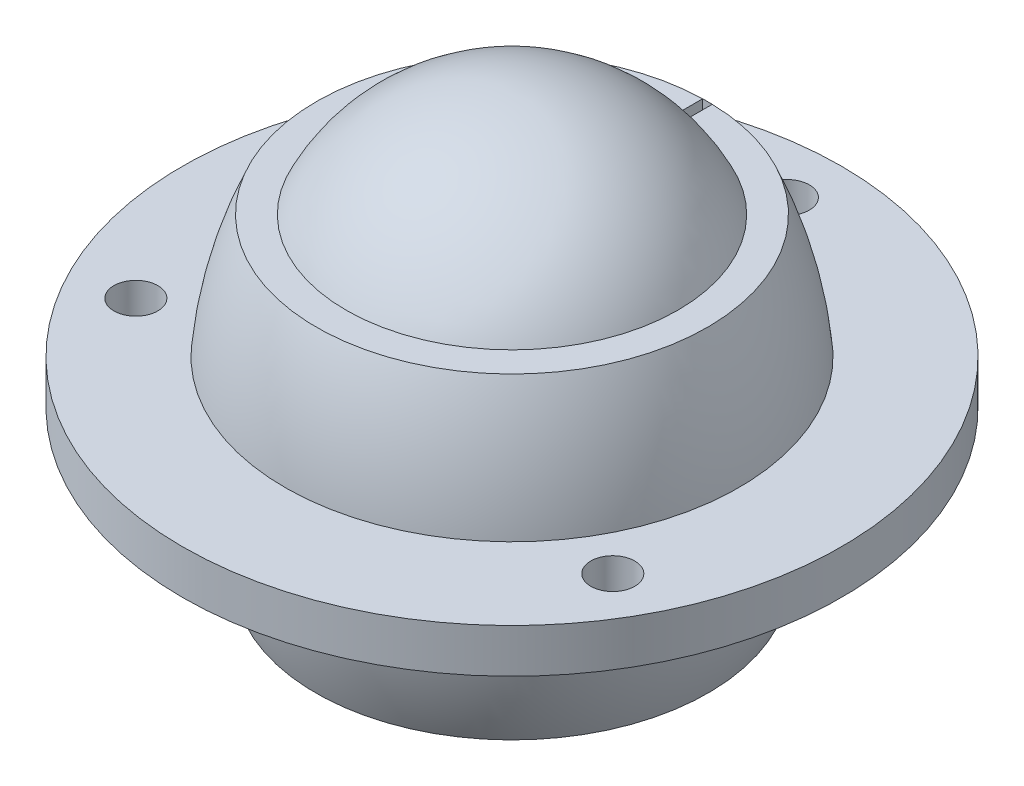
ISO-10303-21;
HEADER;
FILE_DESCRIPTION(('STEP AP214'),'2;1');
FILE_NAME('part.step','',(''),(''),'','','');
FILE_SCHEMA(('AUTOMOTIVE_DESIGN { 1 0 10303 214 1 1 1 1 }'));
ENDSEC;
DATA;
#1=APPLICATION_CONTEXT('core data for automotive mechanical design processes');
#2=APPLICATION_PROTOCOL_DEFINITION('international standard','automotive_design',2000,#1);
#3=PRODUCT_CONTEXT('',#1,'mechanical');
#4=PRODUCT('Part','Part','',(#3));
#5=PRODUCT_RELATED_PRODUCT_CATEGORY('part','',(#4));
#6=PRODUCT_DEFINITION_FORMATION('','',#4);
#7=PRODUCT_DEFINITION_CONTEXT('part definition',#1,'design');
#8=PRODUCT_DEFINITION('design','',#6,#7);
#9=PRODUCT_DEFINITION_SHAPE('','',#8);
#10=(LENGTH_UNIT() NAMED_UNIT(*) SI_UNIT(.MILLI.,.METRE.));
#11=(NAMED_UNIT(*) PLANE_ANGLE_UNIT() SI_UNIT($,.RADIAN.));
#12=(NAMED_UNIT(*) SI_UNIT($,.STERADIAN.) SOLID_ANGLE_UNIT());
#13=UNCERTAINTY_MEASURE_WITH_UNIT(LENGTH_MEASURE(1.E-05),#10,'distance_accuracy_value','');
#14=(GEOMETRIC_REPRESENTATION_CONTEXT(3) GLOBAL_UNCERTAINTY_ASSIGNED_CONTEXT((#13)) GLOBAL_UNIT_ASSIGNED_CONTEXT((#10,
#11,#12)) REPRESENTATION_CONTEXT('',''));
#15=CARTESIAN_POINT('',(0.,0.,0.));
#16=DIRECTION('',(0.,0.,1.));
#17=DIRECTION('',(1.,0.,0.));
#18=AXIS2_PLACEMENT_3D('',#15,#16,#17);
#19=CARTESIAN_POINT('',(13.35,21.6,0.));
#20=DIRECTION('',(0.,1.,0.));
#21=DIRECTION('',(0.,0.,1.));
#22=AXIS2_PLACEMENT_3D('',#19,#20,#21);
#23=PLANE('',#22);
#24=DIRECTION('',(0.,0.,-1.));
#25=VECTOR('',#24,1.);
#26=CARTESIAN_POINT('',(0.329061436236682,21.6,-11.2842389362695));
#27=LINE('',#26,#25);
#28=CARTESIAN_POINT('',(0.329061436236682,21.6,-11.3252204645729));
#29=VERTEX_POINT('',#28);
#30=CARTESIAN_POINT('',(0.329061436236682,21.6,-13.3459438995967));
#31=VERTEX_POINT('',#30);
#32=EDGE_CURVE('E98',#29,#31,#27,.T.);
#33=ORIENTED_EDGE('',*,*,#32,.F.);
#34=CARTESIAN_POINT('',(0.,21.6,0.));
#35=DIRECTION('',(0.,-1.,0.));
#36=DIRECTION('',(0.,0.,-1.));
#37=AXIS2_PLACEMENT_3D('',#34,#35,#36);
#38=CIRCLE('',#37,11.33);
#39=CARTESIAN_POINT('',(-0.329061436236682,21.6,-11.3252204645729));
#40=VERTEX_POINT('',#39);
#41=EDGE_CURVE('E161',#29,#40,#38,.T.);
#42=ORIENTED_EDGE('',*,*,#41,.T.);
#43=DIRECTION('',(0.,0.,1.));
#44=VECTOR('',#43,1.);
#45=CARTESIAN_POINT('',(-0.329061436236682,21.6,-11.2842389362695));
#46=LINE('',#45,#44);
#47=CARTESIAN_POINT('',(-0.329061436236682,21.6,-13.3459438995967));
#48=VERTEX_POINT('',#47);
#49=EDGE_CURVE('E58',#48,#40,#46,.T.);
#50=ORIENTED_EDGE('',*,*,#49,.F.);
#51=CARTESIAN_POINT('',(0.,21.6,0.));
#52=DIRECTION('',(0.,-1.,0.));
#53=DIRECTION('',(0.,0.,-1.));
#54=AXIS2_PLACEMENT_3D('',#51,#52,#53);
#55=CIRCLE('',#54,13.35);
#56=EDGE_CURVE('E164',#31,#48,#55,.T.);
#57=ORIENTED_EDGE('',*,*,#56,.F.);
#58=EDGE_LOOP('',(#33,#42,#50,#57));
#59=FACE_BOUND('',#58,.T.);
#60=ADVANCED_FACE('F39',(#59),#23,.T.);
#61=CARTESIAN_POINT('',(0.,0.,0.));
#62=DIRECTION('',(0.,-1.,0.));
#63=DIRECTION('',(0.,0.,-1.));
#64=AXIS2_PLACEMENT_3D('',#61,#62,#63);
#65=PLANE('',#64);
#66=CARTESIAN_POINT('',(0.,0.,0.));
#67=DIRECTION('',(0.,-1.,0.));
#68=DIRECTION('',(0.,0.,-1.));
#69=AXIS2_PLACEMENT_3D('',#66,#67,#68);
#70=CIRCLE('',#69,13.4);
#71=CARTESIAN_POINT('',(0.,0.,-13.4));
#72=VERTEX_POINT('',#71);
#73=EDGE_CURVE('E11',#72,#72,#70,.T.);
#74=ORIENTED_EDGE('',*,*,#73,.T.);
#75=EDGE_LOOP('',(#74));
#76=FACE_BOUND('',#75,.T.);
#77=ADVANCED_FACE('F41',(#76),#65,.T.);
#78=CARTESIAN_POINT('',(0.,10.7422180573664,0.));
#79=DIRECTION('',(0.,-1.,0.));
#80=DIRECTION('',(0.,0.,-1.));
#81=AXIS2_PLACEMENT_3D('',#78,#79,#80);
#82=DEGENERATE_TOROIDAL_SURFACE('',#81,11.5867992177314,27.1980768426599,.F.);
#83=CARTESIAN_POINT('',(0.,10.2,0.));
#84=DIRECTION('',(0.,-1.,0.));
#85=DIRECTION('',(0.,0.,-1.));
#86=AXIS2_PLACEMENT_3D('',#83,#84,#85);
#87=CIRCLE('',#86,15.6058722861407);
#88=CARTESIAN_POINT('',(0.,10.2,-15.6058722861407));
#89=VERTEX_POINT('',#88);
#90=EDGE_CURVE('E50',#89,#89,#87,.T.);
#91=ORIENTED_EDGE('',*,*,#90,.T.);
#92=EDGE_LOOP('',(#91));
#93=FACE_BOUND('',#92,.T.);
#94=ORIENTED_EDGE('',*,*,#73,.F.);
#95=EDGE_LOOP('',(#94));
#96=FACE_BOUND('',#95,.T.);
#97=ADVANCED_FACE('F198',(#93,#96),#82,.F.);
#98=CARTESIAN_POINT('',(15.6058722861407,10.2,0.));
#99=DIRECTION('',(0.,-1.,0.));
#100=DIRECTION('',(0.,0.,-1.));
#101=AXIS2_PLACEMENT_3D('',#98,#99,#100);
#102=PLANE('',#101);
#103=CARTESIAN_POINT('',(-16.2812775911474,10.2,9.40000000000008));
#104=DIRECTION('',(0.,-1.,0.));
#105=DIRECTION('',(0.,0.,-1.));
#106=AXIS2_PLACEMENT_3D('',#103,#104,#105);
#107=CIRCLE('',#106,1.5);
#108=CARTESIAN_POINT('',(-16.2812775911474,10.2,7.90000000000008));
#109=VERTEX_POINT('',#108);
#110=EDGE_CURVE('E152',#109,#109,#107,.T.);
#111=ORIENTED_EDGE('',*,*,#110,.F.);
#112=EDGE_LOOP('',(#111));
#113=FACE_BOUND('',#112,.T.);
#114=CARTESIAN_POINT('',(16.2812775911475,10.2,9.39999999999985));
#115=DIRECTION('',(0.,-1.,0.));
#116=DIRECTION('',(0.,0.,-1.));
#117=AXIS2_PLACEMENT_3D('',#114,#115,#116);
#118=CIRCLE('',#117,1.5);
#119=CARTESIAN_POINT('',(16.2812775911475,10.2,7.89999999999985));
#120=VERTEX_POINT('',#119);
#121=EDGE_CURVE('E145',#120,#120,#118,.T.);
#122=ORIENTED_EDGE('',*,*,#121,.F.);
#123=EDGE_LOOP('',(#122));
#124=FACE_BOUND('',#123,.T.);
#125=CARTESIAN_POINT('',(0.,10.2,-18.8));
#126=DIRECTION('',(0.,-1.,0.));
#127=DIRECTION('',(0.,0.,-1.));
#128=AXIS2_PLACEMENT_3D('',#125,#126,#127);
#129=CIRCLE('',#128,1.5);
#130=CARTESIAN_POINT('',(0.,10.2,-20.3));
#131=VERTEX_POINT('',#130);
#132=EDGE_CURVE('E158',#131,#131,#129,.T.);
#133=ORIENTED_EDGE('',*,*,#132,.F.);
#134=EDGE_LOOP('',(#133));
#135=FACE_BOUND('',#134,.T.);
#136=CARTESIAN_POINT('',(0.,10.2,0.));
#137=DIRECTION('',(0.,-1.,0.));
#138=DIRECTION('',(0.,0.,-1.));
#139=AXIS2_PLACEMENT_3D('',#136,#137,#138);
#140=CIRCLE('',#139,22.5);
#141=CARTESIAN_POINT('',(0.,10.2,-22.5));
#142=VERTEX_POINT('',#141);
#143=EDGE_CURVE('E221',#142,#142,#140,.T.);
#144=ORIENTED_EDGE('',*,*,#143,.T.);
#145=EDGE_LOOP('',(#144));
#146=FACE_BOUND('',#145,.T.);
#147=ORIENTED_EDGE('',*,*,#90,.F.);
#148=EDGE_LOOP('',(#147));
#149=FACE_BOUND('',#148,.T.);
#150=ADVANCED_FACE('F208',(#113,#124,#135,#146,#149),#102,.T.);
#151=CARTESIAN_POINT('',(0.,28.73,0.));
#152=DIRECTION('',(0.,-1.,0.));
#153=DIRECTION('',(0.,0.,-1.));
#154=AXIS2_PLACEMENT_3D('',#151,#152,#153);
#155=CYLINDRICAL_SURFACE('',#154,22.5);
#156=CARTESIAN_POINT('',(0.,13.2,0.));
#157=DIRECTION('',(0.,-1.,0.));
#158=DIRECTION('',(0.,0.,-1.));
#159=AXIS2_PLACEMENT_3D('',#156,#157,#158);
#160=CIRCLE('',#159,22.5);
#161=CARTESIAN_POINT('',(0.,13.2,-22.5));
#162=VERTEX_POINT('',#161);
#163=EDGE_CURVE('E223',#162,#162,#160,.T.);
#164=ORIENTED_EDGE('',*,*,#163,.T.);
#165=EDGE_LOOP('',(#164));
#166=FACE_BOUND('',#165,.T.);
#167=ORIENTED_EDGE('',*,*,#143,.F.);
#168=EDGE_LOOP('',(#167));
#169=FACE_BOUND('',#168,.T.);
#170=ADVANCED_FACE('F204',(#166,#169),#155,.T.);
#171=CARTESIAN_POINT('',(22.5,13.2,0.));
#172=DIRECTION('',(0.,1.,0.));
#173=DIRECTION('',(0.,0.,1.));
#174=AXIS2_PLACEMENT_3D('',#171,#172,#173);
#175=PLANE('',#174);
#176=CARTESIAN_POINT('',(-16.2812775911474,13.2,9.40000000000008));
#177=DIRECTION('',(0.,1.,0.));
#178=DIRECTION('',(0.866025403784436,0.,-0.500000000000004));
#179=AXIS2_PLACEMENT_3D('',#176,#177,#178);
#180=CIRCLE('',#179,1.5);
#181=CARTESIAN_POINT('',(-14.9822394854707,13.2,8.65000000000007));
#182=VERTEX_POINT('',#181);
#183=EDGE_CURVE('E142',#182,#182,#180,.T.);
#184=ORIENTED_EDGE('',*,*,#183,.F.);
#185=EDGE_LOOP('',(#184));
#186=FACE_BOUND('',#185,.T.);
#187=CARTESIAN_POINT('',(16.2812775911475,13.2,9.39999999999985));
#188=DIRECTION('',(0.,1.,0.));
#189=DIRECTION('',(-0.866025403784443,0.,-0.499999999999992));
#190=AXIS2_PLACEMENT_3D('',#187,#188,#189);
#191=CIRCLE('',#190,1.5);
#192=CARTESIAN_POINT('',(14.9822394854709,13.2,8.64999999999986));
#193=VERTEX_POINT('',#192);
#194=EDGE_CURVE('E146',#193,#193,#191,.T.);
#195=ORIENTED_EDGE('',*,*,#194,.F.);
#196=EDGE_LOOP('',(#195));
#197=FACE_BOUND('',#196,.T.);
#198=CARTESIAN_POINT('',(0.,13.2,-18.8));
#199=DIRECTION('',(0.,1.,0.));
#200=DIRECTION('',(0.,0.,1.));
#201=AXIS2_PLACEMENT_3D('',#198,#199,#200);
#202=CIRCLE('',#201,1.5);
#203=CARTESIAN_POINT('',(0.,13.2,-17.3));
#204=VERTEX_POINT('',#203);
#205=EDGE_CURVE('E155',#204,#204,#202,.T.);
#206=ORIENTED_EDGE('',*,*,#205,.F.);
#207=EDGE_LOOP('',(#206));
#208=FACE_BOUND('',#207,.T.);
#209=CARTESIAN_POINT('',(0.,13.2,0.));
#210=DIRECTION('',(0.,-1.,0.));
#211=DIRECTION('',(0.,0.,-1.));
#212=AXIS2_PLACEMENT_3D('',#209,#210,#211);
#213=CIRCLE('',#212,15.5);
#214=CARTESIAN_POINT('',(0.,13.2,-15.5));
#215=VERTEX_POINT('',#214);
#216=EDGE_CURVE('E167',#215,#215,#213,.T.);
#217=ORIENTED_EDGE('',*,*,#216,.T.);
#218=EDGE_LOOP('',(#217));
#219=FACE_BOUND('',#218,.T.);
#220=ORIENTED_EDGE('',*,*,#163,.F.);
#221=EDGE_LOOP('',(#220));
#222=FACE_BOUND('',#221,.T.);
#223=ADVANCED_FACE('F191',(#186,#197,#208,#219,#222),#175,.T.);
#224=CARTESIAN_POINT('',(0.,10.7422180573664,0.));
#225=DIRECTION('',(0.,-1.,0.));
#226=DIRECTION('',(0.,0.,-1.));
#227=AXIS2_PLACEMENT_3D('',#224,#225,#226);
#228=DEGENERATE_TOROIDAL_SURFACE('',#227,11.5867992177314,27.1980768426599,.F.);
#229=ORIENTED_EDGE('',*,*,#56,.T.);
#230=CARTESIAN_POINT('',(0.329061436236682,21.6,-13.3459438995967));
#231=DIRECTION('',(-1.,0.,0.));
#232=VECTOR('',#231,1.);
#233=LINE('',#230,#232);
#234=EDGE_CURVE('E125',#31,#48,#233,.T.);
#235=ORIENTED_EDGE('',*,*,#234,.F.);
#236=EDGE_LOOP('',(#229,#235));
#237=FACE_BOUND('',#236,.T.);
#238=ORIENTED_EDGE('',*,*,#216,.F.);
#239=EDGE_LOOP('',(#238));
#240=FACE_BOUND('',#239,.T.);
#241=ADVANCED_FACE('F174',(#237,#240),#228,.F.);
#242=CARTESIAN_POINT('',(0.,16.1629733520337,0.));
#243=DIRECTION('',(0.,-1.,0.));
#244=DIRECTION('',(1.,0.,0.));
#245=AXIS2_PLACEMENT_3D('',#242,#243,#244);
#246=SPHERICAL_SURFACE('',#245,12.5670266479663);
#247=ORIENTED_EDGE('',*,*,#41,.F.);
#248=EDGE_CURVE('E65',#40,#29,#38,.T.);
#249=ORIENTED_EDGE('',*,*,#248,.F.);
#250=EDGE_LOOP('',(#247,#249));
#251=FACE_BOUND('',#250,.T.);
#252=ADVANCED_FACE('F179',(#251),#246,.T.);
#253=CARTESIAN_POINT('',(0.,3.2,-18.8));
#254=DIRECTION('',(0.,1.,0.));
#255=DIRECTION('',(0.,0.,1.));
#256=AXIS2_PLACEMENT_3D('',#253,#254,#255);
#257=CYLINDRICAL_SURFACE('',#256,1.5);
#258=ORIENTED_EDGE('',*,*,#132,.T.);
#259=EDGE_LOOP('',(#258));
#260=FACE_BOUND('',#259,.T.);
#261=ORIENTED_EDGE('',*,*,#205,.T.);
#262=EDGE_LOOP('',(#261));
#263=FACE_BOUND('',#262,.T.);
#264=ADVANCED_FACE('F181',(#260,#263),#257,.F.);
#265=CARTESIAN_POINT('',(16.2812775911475,3.2,9.39999999999985));
#266=DIRECTION('',(0.,1.,0.));
#267=DIRECTION('',(0.,0.,1.));
#268=AXIS2_PLACEMENT_3D('',#265,#266,#267);
#269=CYLINDRICAL_SURFACE('',#268,1.5);
#270=ORIENTED_EDGE('',*,*,#121,.T.);
#271=EDGE_LOOP('',(#270));
#272=FACE_BOUND('',#271,.T.);
#273=ORIENTED_EDGE('',*,*,#194,.T.);
#274=EDGE_LOOP('',(#273));
#275=FACE_BOUND('',#274,.T.);
#276=ADVANCED_FACE('F188',(#272,#275),#269,.F.);
#277=CARTESIAN_POINT('',(-16.2812775911474,3.2,9.40000000000008));
#278=DIRECTION('',(0.,1.,0.));
#279=DIRECTION('',(0.,0.,1.));
#280=AXIS2_PLACEMENT_3D('',#277,#278,#279);
#281=CYLINDRICAL_SURFACE('',#280,1.5);
#282=ORIENTED_EDGE('',*,*,#110,.T.);
#283=EDGE_LOOP('',(#282));
#284=FACE_BOUND('',#283,.T.);
#285=ORIENTED_EDGE('',*,*,#183,.T.);
#286=EDGE_LOOP('',(#285));
#287=FACE_BOUND('',#286,.T.);
#288=ADVANCED_FACE('F268',(#284,#287),#281,.F.);
#289=CARTESIAN_POINT('',(0.329061436236682,20.6,-11.2842389362695));
#290=DIRECTION('',(1.,0.,0.));
#291=DIRECTION('',(0.,0.,-1.));
#292=AXIS2_PLACEMENT_3D('',#289,#290,#291);
#293=PLANE('',#292);
#294=CARTESIAN_POINT('',(0.329061436236682,21.6,-11.2842389362695));
#295=VERTEX_POINT('',#294);
#296=EDGE_CURVE('E122',#295,#29,#27,.T.);
#297=ORIENTED_EDGE('',*,*,#296,.T.);
#298=ORIENTED_EDGE('',*,*,#32,.T.);
#299=DIRECTION('',(0.,1.,0.));
#300=VECTOR('',#299,1.);
#301=CARTESIAN_POINT('',(0.329061436236682,20.6,-13.3459438995967));
#302=LINE('',#301,#300);
#303=CARTESIAN_POINT('',(0.329061436236682,20.6,-13.3459438995967));
#304=VERTEX_POINT('',#303);
#305=EDGE_CURVE('E91',#304,#31,#302,.T.);
#306=ORIENTED_EDGE('',*,*,#305,.F.);
#307=DIRECTION('',(0.,0.,-1.));
#308=VECTOR('',#307,1.);
#309=CARTESIAN_POINT('',(0.329061436236682,20.6,-11.2842389362695));
#310=LINE('',#309,#308);
#311=CARTESIAN_POINT('',(0.329061436236682,20.6,-11.2842389362695));
#312=VERTEX_POINT('',#311);
#313=EDGE_CURVE('E95',#312,#304,#310,.T.);
#314=ORIENTED_EDGE('',*,*,#313,.F.);
#315=DIRECTION('',(0.,1.,0.));
#316=VECTOR('',#315,1.);
#317=CARTESIAN_POINT('',(0.329061436236682,20.6,-11.2842389362695));
#318=LINE('',#317,#316);
#319=EDGE_CURVE('E149',#312,#295,#318,.T.);
#320=ORIENTED_EDGE('',*,*,#319,.T.);
#321=EDGE_LOOP('',(#297,#298,#306,#314,#320));
#322=FACE_BOUND('',#321,.T.);
#323=ADVANCED_FACE('F93',(#322),#293,.F.);
#324=CARTESIAN_POINT('',(-0.329061436236682,20.6,-11.2842389362695));
#325=DIRECTION('',(0.,0.,1.));
#326=DIRECTION('',(1.,0.,0.));
#327=AXIS2_PLACEMENT_3D('',#324,#325,#326);
#328=PLANE('',#327);
#329=DIRECTION('',(1.,0.,0.));
#330=VECTOR('',#329,1.);
#331=CARTESIAN_POINT('',(-0.329061436236682,21.6,-11.2842389362695));
#332=LINE('',#331,#330);
#333=CARTESIAN_POINT('',(-0.329061436236682,21.6,-11.2842389362695));
#334=VERTEX_POINT('',#333);
#335=EDGE_CURVE('E115',#334,#295,#332,.T.);
#336=ORIENTED_EDGE('',*,*,#335,.T.);
#337=ORIENTED_EDGE('',*,*,#319,.F.);
#338=DIRECTION('',(1.,0.,0.));
#339=VECTOR('',#338,1.);
#340=CARTESIAN_POINT('',(-0.329061436236682,20.6,-11.2842389362695));
#341=LINE('',#340,#339);
#342=CARTESIAN_POINT('',(-0.329061436236682,20.6,-11.2842389362695));
#343=VERTEX_POINT('',#342);
#344=EDGE_CURVE('E103',#343,#312,#341,.T.);
#345=ORIENTED_EDGE('',*,*,#344,.F.);
#346=DIRECTION('',(0.,1.,0.));
#347=VECTOR('',#346,1.);
#348=CARTESIAN_POINT('',(-0.329061436236682,20.6,-11.2842389362695));
#349=LINE('',#348,#347);
#350=EDGE_CURVE('E138',#343,#334,#349,.T.);
#351=ORIENTED_EDGE('',*,*,#350,.T.);
#352=EDGE_LOOP('',(#336,#337,#345,#351));
#353=FACE_BOUND('',#352,.T.);
#354=ADVANCED_FACE('F286',(#353),#328,.F.);
#355=CARTESIAN_POINT('',(-0.329061436236682,20.6,-11.2842389362695));
#356=DIRECTION('',(-1.,0.,0.));
#357=DIRECTION('',(0.,0.,1.));
#358=AXIS2_PLACEMENT_3D('',#355,#356,#357);
#359=PLANE('',#358);
#360=ORIENTED_EDGE('',*,*,#49,.T.);
#361=EDGE_CURVE('E126',#40,#334,#46,.T.);
#362=ORIENTED_EDGE('',*,*,#361,.T.);
#363=ORIENTED_EDGE('',*,*,#350,.F.);
#364=DIRECTION('',(0.,0.,1.));
#365=VECTOR('',#364,1.);
#366=CARTESIAN_POINT('',(-0.329061436236682,20.6,-11.2842389362695));
#367=LINE('',#366,#365);
#368=CARTESIAN_POINT('',(-0.329061436236682,20.6,-13.3459438995967));
#369=VERTEX_POINT('',#368);
#370=EDGE_CURVE('E111',#369,#343,#367,.T.);
#371=ORIENTED_EDGE('',*,*,#370,.F.);
#372=DIRECTION('',(0.,1.,0.));
#373=VECTOR('',#372,1.);
#374=CARTESIAN_POINT('',(-0.329061436236682,20.6,-13.3459438995967));
#375=LINE('',#374,#373);
#376=EDGE_CURVE('E102',#369,#48,#375,.T.);
#377=ORIENTED_EDGE('',*,*,#376,.T.);
#378=EDGE_LOOP('',(#360,#362,#363,#371,#377));
#379=FACE_BOUND('',#378,.T.);
#380=ADVANCED_FACE('F292',(#379),#359,.F.);
#381=CARTESIAN_POINT('',(-0.329061436236682,20.6,-13.3459438995967));
#382=DIRECTION('',(0.,0.,-1.));
#383=DIRECTION('',(-1.,0.,0.));
#384=AXIS2_PLACEMENT_3D('',#381,#382,#383);
#385=PLANE('',#384);
#386=ORIENTED_EDGE('',*,*,#234,.T.);
#387=ORIENTED_EDGE('',*,*,#376,.F.);
#388=DIRECTION('',(-1.,0.,0.));
#389=VECTOR('',#388,1.);
#390=CARTESIAN_POINT('',(-0.329061436236682,20.6,-13.3459438995967));
#391=LINE('',#390,#389);
#392=EDGE_CURVE('E106',#304,#369,#391,.T.);
#393=ORIENTED_EDGE('',*,*,#392,.F.);
#394=ORIENTED_EDGE('',*,*,#305,.T.);
#395=EDGE_LOOP('',(#386,#387,#393,#394));
#396=FACE_BOUND('',#395,.T.);
#397=ADVANCED_FACE('F107',(#396),#385,.F.);
#398=CARTESIAN_POINT('',(0.,20.6,0.));
#399=DIRECTION('',(0.,-1.,0.));
#400=DIRECTION('',(0.,0.,-1.));
#401=AXIS2_PLACEMENT_3D('',#398,#399,#400);
#402=PLANE('',#401);
#403=ORIENTED_EDGE('',*,*,#313,.T.);
#404=ORIENTED_EDGE('',*,*,#392,.T.);
#405=ORIENTED_EDGE('',*,*,#370,.T.);
#406=ORIENTED_EDGE('',*,*,#344,.T.);
#407=EDGE_LOOP('',(#403,#404,#405,#406));
#408=FACE_BOUND('',#407,.T.);
#409=ADVANCED_FACE('F113',(#408),#402,.F.);
#410=CARTESIAN_POINT('',(0.,21.6,0.));
#411=DIRECTION('',(0.,-1.,0.));
#412=DIRECTION('',(0.,0.,-1.));
#413=AXIS2_PLACEMENT_3D('',#410,#411,#412);
#414=PLANE('',#413);
#415=ORIENTED_EDGE('',*,*,#296,.F.);
#416=ORIENTED_EDGE('',*,*,#335,.F.);
#417=ORIENTED_EDGE('',*,*,#361,.F.);
#418=ORIENTED_EDGE('',*,*,#248,.T.);
#419=EDGE_LOOP('',(#415,#416,#417,#418));
#420=FACE_BOUND('',#419,.T.);
#421=ADVANCED_FACE('F311',(#420),#414,.T.);
#422=CLOSED_SHELL('',(#60,#77,#97,#150,#170,#223,#241,#252,#264,#276,#288,#323,#354,#380,#397,
#409,#421));
#423=MANIFOLD_SOLID_BREP('B2',#422);
#424=ADVANCED_BREP_SHAPE_REPRESENTATION('',(#18,#423),#14);
#425=SHAPE_DEFINITION_REPRESENTATION(#9,#424);
ENDSEC;
END-ISO-10303-21;
